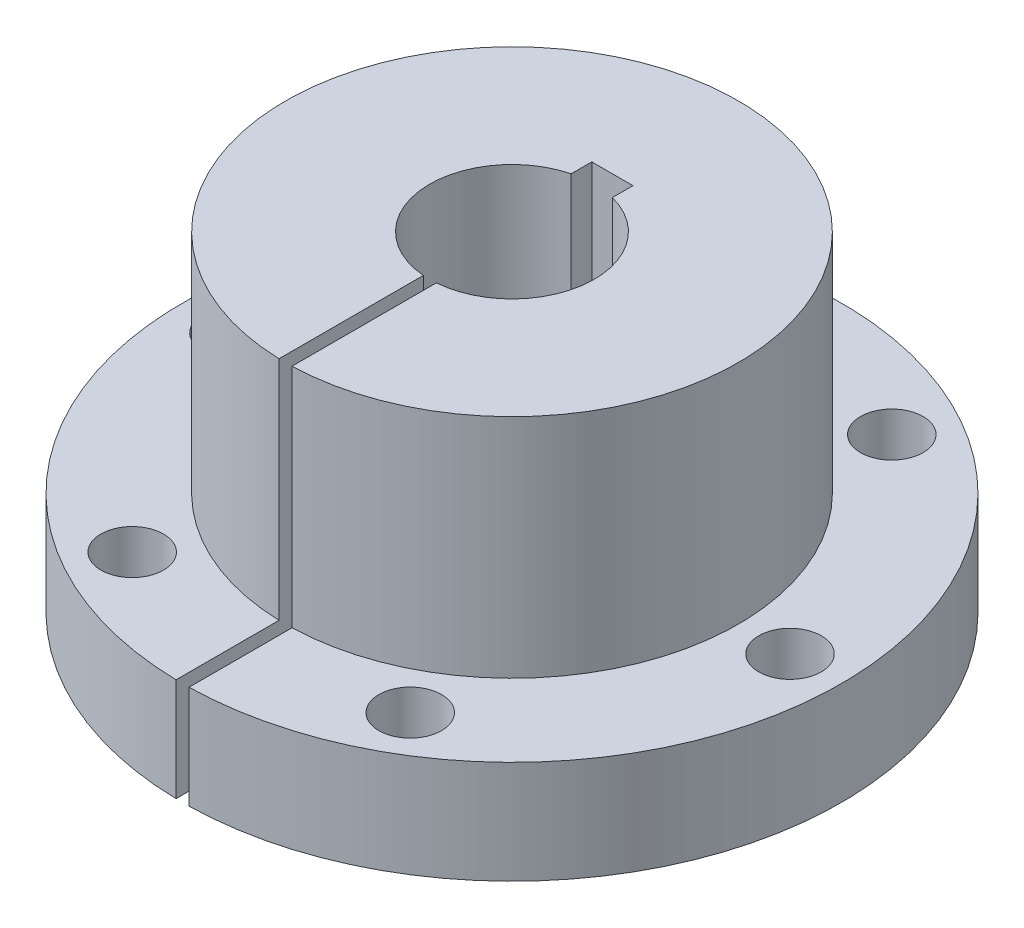
ISO-10303-21;
HEADER;
FILE_DESCRIPTION(('STEP AP214'),'2;1');
FILE_NAME('part.step','',(''),(''),'','','');
FILE_SCHEMA(('AUTOMOTIVE_DESIGN { 1 0 10303 214 1 1 1 1 }'));
ENDSEC;
DATA;
#1=APPLICATION_CONTEXT('core data for automotive mechanical design processes');
#2=APPLICATION_PROTOCOL_DEFINITION('international standard','automotive_design',2000,#1);
#3=PRODUCT_CONTEXT('',#1,'mechanical');
#4=PRODUCT('Part','Part','',(#3));
#5=PRODUCT_RELATED_PRODUCT_CATEGORY('part','',(#4));
#6=PRODUCT_DEFINITION_FORMATION('','',#4);
#7=PRODUCT_DEFINITION_CONTEXT('part definition',#1,'design');
#8=PRODUCT_DEFINITION('design','',#6,#7);
#9=PRODUCT_DEFINITION_SHAPE('','',#8);
#10=(LENGTH_UNIT() NAMED_UNIT(*) SI_UNIT(.MILLI.,.METRE.));
#11=(NAMED_UNIT(*) PLANE_ANGLE_UNIT() SI_UNIT($,.RADIAN.));
#12=(NAMED_UNIT(*) SI_UNIT($,.STERADIAN.) SOLID_ANGLE_UNIT());
#13=UNCERTAINTY_MEASURE_WITH_UNIT(LENGTH_MEASURE(1.E-05),#10,'distance_accuracy_value','');
#14=(GEOMETRIC_REPRESENTATION_CONTEXT(3) GLOBAL_UNCERTAINTY_ASSIGNED_CONTEXT((#13)) GLOBAL_UNIT_ASSIGNED_CONTEXT((#10,
#11,#12)) REPRESENTATION_CONTEXT('',''));
#15=CARTESIAN_POINT('',(0.,0.,0.));
#16=DIRECTION('',(0.,0.,1.));
#17=DIRECTION('',(1.,0.,0.));
#18=AXIS2_PLACEMENT_3D('',#15,#16,#17);
#19=CARTESIAN_POINT('',(0.,7.9375,0.));
#20=DIRECTION('',(0.,-1.,0.));
#21=DIRECTION('',(0.,0.,-1.));
#22=AXIS2_PLACEMENT_3D('',#19,#20,#21);
#23=CYLINDRICAL_SURFACE('',#22,25.4);
#24=CARTESIAN_POINT('',(0.,7.9375,0.));
#25=DIRECTION('',(0.,1.,0.));
#26=DIRECTION('',(0.,0.,1.));
#27=AXIS2_PLACEMENT_3D('',#24,#25,#26);
#28=CIRCLE('',#27,25.4);
#29=CARTESIAN_POINT('',(0.5,7.9375,25.3950782633171));
#30=VERTEX_POINT('',#29);
#31=CARTESIAN_POINT('',(-0.5,7.9375,25.3950782633171));
#32=VERTEX_POINT('',#31);
#33=EDGE_CURVE('E230',#30,#32,#28,.T.);
#34=ORIENTED_EDGE('',*,*,#33,.F.);
#35=DIRECTION('',(0.,-1.,0.));
#36=VECTOR('',#35,1.);
#37=CARTESIAN_POINT('',(0.5,7.9375,25.3950782633171));
#38=LINE('',#37,#36);
#39=CARTESIAN_POINT('',(0.5,0.,25.3950782633171));
#40=VERTEX_POINT('',#39);
#41=EDGE_CURVE('E68',#30,#40,#38,.T.);
#42=ORIENTED_EDGE('',*,*,#41,.T.);
#43=CARTESIAN_POINT('',(0.,0.,0.));
#44=DIRECTION('',(0.,1.,0.));
#45=DIRECTION('',(0.,0.,1.));
#46=AXIS2_PLACEMENT_3D('',#43,#44,#45);
#47=CIRCLE('',#46,25.4);
#48=CARTESIAN_POINT('',(-0.5,0.,25.3950782633171));
#49=VERTEX_POINT('',#48);
#50=EDGE_CURVE('E226',#40,#49,#47,.T.);
#51=ORIENTED_EDGE('',*,*,#50,.T.);
#52=DIRECTION('',(0.,-1.,0.));
#53=VECTOR('',#52,1.);
#54=CARTESIAN_POINT('',(-0.5,7.9375,25.3950782633171));
#55=LINE('',#54,#53);
#56=EDGE_CURVE('E135',#49,#32,#55,.F.);
#57=ORIENTED_EDGE('',*,*,#56,.T.);
#58=EDGE_LOOP('',(#34,#42,#51,#57));
#59=FACE_BOUND('',#58,.T.);
#60=ADVANCED_FACE('F45',(#59),#23,.T.);
#61=CARTESIAN_POINT('',(0.,7.9375,0.));
#62=DIRECTION('',(0.,1.,0.));
#63=DIRECTION('',(0.,0.,1.));
#64=AXIS2_PLACEMENT_3D('',#61,#62,#63);
#65=PLANE('',#64);
#66=CARTESIAN_POINT('',(-10.7156250000002,7.9375,-18.5600069348551));
#67=DIRECTION('',(0.,1.,0.));
#68=DIRECTION('',(-0.866025403784433,0.,0.50000000000001));
#69=AXIS2_PLACEMENT_3D('',#66,#67,#68);
#70=CIRCLE('',#69,2.413);
#71=CARTESIAN_POINT('',(-12.8053442993321,7.9375,-17.3535069348551));
#72=VERTEX_POINT('',#71);
#73=EDGE_CURVE('E350',#72,#72,#70,.T.);
#74=ORIENTED_EDGE('',*,*,#73,.F.);
#75=EDGE_LOOP('',(#74));
#76=FACE_BOUND('',#75,.T.);
#77=CARTESIAN_POINT('',(10.7156249999998,7.9375,-18.5600069348553));
#78=DIRECTION('',(0.,1.,0.));
#79=DIRECTION('',(-0.866025403784443,0.,-0.499999999999992));
#80=AXIS2_PLACEMENT_3D('',#77,#78,#79);
#81=CIRCLE('',#80,2.413);
#82=CARTESIAN_POINT('',(8.62590570066797,7.9375,-19.7665069348553));
#83=VERTEX_POINT('',#82);
#84=EDGE_CURVE('E342',#83,#83,#81,.T.);
#85=ORIENTED_EDGE('',*,*,#84,.F.);
#86=EDGE_LOOP('',(#85));
#87=FACE_BOUND('',#86,.T.);
#88=CARTESIAN_POINT('',(21.43125,7.9375,0.));
#89=DIRECTION('',(0.,1.,0.));
#90=DIRECTION('',(0.,0.,-1.));
#91=AXIS2_PLACEMENT_3D('',#88,#89,#90);
#92=CIRCLE('',#91,2.413);
#93=CARTESIAN_POINT('',(21.43125,7.9375,-2.413));
#94=VERTEX_POINT('',#93);
#95=EDGE_CURVE('E332',#94,#94,#92,.T.);
#96=ORIENTED_EDGE('',*,*,#95,.F.);
#97=EDGE_LOOP('',(#96));
#98=FACE_BOUND('',#97,.T.);
#99=CARTESIAN_POINT('',(10.7156250000001,7.9375,18.5600069348552));
#100=DIRECTION('',(0.,1.,0.));
#101=DIRECTION('',(0.866025403784436,0.,-0.500000000000004));
#102=AXIS2_PLACEMENT_3D('',#99,#100,#101);
#103=CIRCLE('',#102,2.413);
#104=CARTESIAN_POINT('',(12.8053442993319,7.9375,17.3535069348552));
#105=VERTEX_POINT('',#104);
#106=EDGE_CURVE('E322',#105,#105,#103,.T.);
#107=ORIENTED_EDGE('',*,*,#106,.F.);
#108=EDGE_LOOP('',(#107));
#109=FACE_BOUND('',#108,.T.);
#110=CARTESIAN_POINT('',(-10.715625,7.9375,18.5600069348553));
#111=DIRECTION('',(0.,1.,0.));
#112=DIRECTION('',(0.86602540378444,0.,0.499999999999998));
#113=AXIS2_PLACEMENT_3D('',#110,#111,#112);
#114=CIRCLE('',#113,2.413);
#115=CARTESIAN_POINT('',(-8.6259057006681,7.9375,19.7665069348553));
#116=VERTEX_POINT('',#115);
#117=EDGE_CURVE('E329',#116,#116,#114,.T.);
#118=ORIENTED_EDGE('',*,*,#117,.F.);
#119=EDGE_LOOP('',(#118));
#120=FACE_BOUND('',#119,.T.);
#121=CARTESIAN_POINT('',(-21.43125,7.9375,0.));
#122=DIRECTION('',(0.,1.,0.));
#123=DIRECTION('',(0.,0.,1.));
#124=AXIS2_PLACEMENT_3D('',#121,#122,#123);
#125=CIRCLE('',#124,2.413);
#126=CARTESIAN_POINT('',(-21.43125,7.9375,2.413));
#127=VERTEX_POINT('',#126);
#128=EDGE_CURVE('E153',#127,#127,#125,.T.);
#129=ORIENTED_EDGE('',*,*,#128,.F.);
#130=EDGE_LOOP('',(#129));
#131=FACE_BOUND('',#130,.T.);
#132=DIRECTION('',(0.,0.,-1.));
#133=VECTOR('',#132,1.);
#134=CARTESIAN_POINT('',(0.5,7.9375,0.));
#135=LINE('',#134,#133);
#136=CARTESIAN_POINT('',(0.5,7.9375,17.4553403361264));
#137=VERTEX_POINT('',#136);
#138=EDGE_CURVE('E217',#30,#137,#135,.T.);
#139=ORIENTED_EDGE('',*,*,#138,.F.);
#140=ORIENTED_EDGE('',*,*,#33,.T.);
#141=DIRECTION('',(0.,0.,1.));
#142=VECTOR('',#141,1.);
#143=CARTESIAN_POINT('',(-0.5,7.9375,0.));
#144=LINE('',#143,#142);
#145=CARTESIAN_POINT('',(-0.5,7.9375,17.4553403361264));
#146=VERTEX_POINT('',#145);
#147=EDGE_CURVE('E208',#146,#32,#144,.T.);
#148=ORIENTED_EDGE('',*,*,#147,.F.);
#149=CARTESIAN_POINT('',(0.,7.9375,0.));
#150=DIRECTION('',(0.,1.,0.));
#151=DIRECTION('',(0.,0.,1.));
#152=AXIS2_PLACEMENT_3D('',#149,#150,#151);
#153=CIRCLE('',#152,17.4625);
#154=EDGE_CURVE('E53',#137,#146,#153,.T.);
#155=ORIENTED_EDGE('',*,*,#154,.F.);
#156=EDGE_LOOP('',(#139,#140,#148,#155));
#157=FACE_BOUND('',#156,.T.);
#158=ADVANCED_FACE('F261',(#76,#87,#98,#109,#120,#131,#157),#65,.T.);
#159=CARTESIAN_POINT('',(0.,0.,0.));
#160=DIRECTION('',(0.,1.,0.));
#161=DIRECTION('',(0.,0.,1.));
#162=AXIS2_PLACEMENT_3D('',#159,#160,#161);
#163=PLANE('',#162);
#164=CARTESIAN_POINT('',(-10.7156250000002,0.,-18.5600069348551));
#165=DIRECTION('',(0.,1.,0.));
#166=DIRECTION('',(-0.866025403784433,0.,0.50000000000001));
#167=AXIS2_PLACEMENT_3D('',#164,#165,#166);
#168=CIRCLE('',#167,2.413);
#169=CARTESIAN_POINT('',(-12.8053442993321,0.,-17.3535069348551));
#170=VERTEX_POINT('',#169);
#171=EDGE_CURVE('E346',#170,#170,#168,.T.);
#172=ORIENTED_EDGE('',*,*,#171,.T.);
#173=EDGE_LOOP('',(#172));
#174=FACE_BOUND('',#173,.T.);
#175=CARTESIAN_POINT('',(10.7156249999998,0.,-18.5600069348553));
#176=DIRECTION('',(0.,1.,0.));
#177=DIRECTION('',(-0.866025403784443,0.,-0.499999999999992));
#178=AXIS2_PLACEMENT_3D('',#175,#176,#177);
#179=CIRCLE('',#178,2.413);
#180=CARTESIAN_POINT('',(8.62590570066797,0.,-19.7665069348553));
#181=VERTEX_POINT('',#180);
#182=EDGE_CURVE('E338',#181,#181,#179,.T.);
#183=ORIENTED_EDGE('',*,*,#182,.T.);
#184=EDGE_LOOP('',(#183));
#185=FACE_BOUND('',#184,.T.);
#186=CARTESIAN_POINT('',(21.43125,0.,0.));
#187=DIRECTION('',(0.,1.,0.));
#188=DIRECTION('',(0.,0.,-1.));
#189=AXIS2_PLACEMENT_3D('',#186,#187,#188);
#190=CIRCLE('',#189,2.413);
#191=CARTESIAN_POINT('',(21.43125,0.,-2.413));
#192=VERTEX_POINT('',#191);
#193=EDGE_CURVE('E325',#192,#192,#190,.T.);
#194=ORIENTED_EDGE('',*,*,#193,.T.);
#195=EDGE_LOOP('',(#194));
#196=FACE_BOUND('',#195,.T.);
#197=CARTESIAN_POINT('',(10.7156250000001,0.,18.5600069348552));
#198=DIRECTION('',(0.,1.,0.));
#199=DIRECTION('',(0.866025403784436,0.,-0.500000000000004));
#200=AXIS2_PLACEMENT_3D('',#197,#198,#199);
#201=CIRCLE('',#200,2.413);
#202=CARTESIAN_POINT('',(12.8053442993319,0.,17.3535069348552));
#203=VERTEX_POINT('',#202);
#204=EDGE_CURVE('E319',#203,#203,#201,.T.);
#205=ORIENTED_EDGE('',*,*,#204,.T.);
#206=EDGE_LOOP('',(#205));
#207=FACE_BOUND('',#206,.T.);
#208=CARTESIAN_POINT('',(-10.715625,0.,18.5600069348553));
#209=DIRECTION('',(0.,1.,0.));
#210=DIRECTION('',(0.86602540378444,0.,0.499999999999998));
#211=AXIS2_PLACEMENT_3D('',#208,#209,#210);
#212=CIRCLE('',#211,2.413);
#213=CARTESIAN_POINT('',(-8.6259057006681,0.,19.7665069348553));
#214=VERTEX_POINT('',#213);
#215=EDGE_CURVE('E354',#214,#214,#212,.T.);
#216=ORIENTED_EDGE('',*,*,#215,.T.);
#217=EDGE_LOOP('',(#216));
#218=FACE_BOUND('',#217,.T.);
#219=CARTESIAN_POINT('',(-21.43125,0.,0.));
#220=DIRECTION('',(0.,1.,0.));
#221=DIRECTION('',(0.,0.,1.));
#222=AXIS2_PLACEMENT_3D('',#219,#220,#221);
#223=CIRCLE('',#222,2.413);
#224=CARTESIAN_POINT('',(-21.43125,0.,2.413));
#225=VERTEX_POINT('',#224);
#226=EDGE_CURVE('E175',#225,#225,#223,.T.);
#227=ORIENTED_EDGE('',*,*,#226,.T.);
#228=EDGE_LOOP('',(#227));
#229=FACE_BOUND('',#228,.T.);
#230=ORIENTED_EDGE('',*,*,#50,.F.);
#231=DIRECTION('',(0.,0.,-1.));
#232=VECTOR('',#231,1.);
#233=CARTESIAN_POINT('',(0.5,0.,6.33028435380276));
#234=LINE('',#233,#232);
#235=CARTESIAN_POINT('',(0.5,0.,6.33028435380276));
#236=VERTEX_POINT('',#235);
#237=EDGE_CURVE('E140',#40,#236,#234,.T.);
#238=ORIENTED_EDGE('',*,*,#237,.T.);
#239=CARTESIAN_POINT('',(0.,0.,0.));
#240=DIRECTION('',(0.,1.,0.));
#241=DIRECTION('',(0.,0.,1.));
#242=AXIS2_PLACEMENT_3D('',#239,#240,#241);
#243=CIRCLE('',#242,6.35);
#244=CARTESIAN_POINT('',(1.5875,0.,-6.14836106210427));
#245=VERTEX_POINT('',#244);
#246=EDGE_CURVE('E159',#236,#245,#243,.T.);
#247=ORIENTED_EDGE('',*,*,#246,.T.);
#248=DIRECTION('',(0.,0.,-1.));
#249=VECTOR('',#248,1.);
#250=CARTESIAN_POINT('',(1.5875,0.,-7.73586106210427));
#251=LINE('',#250,#249);
#252=CARTESIAN_POINT('',(1.5875,0.,-7.73586106210427));
#253=VERTEX_POINT('',#252);
#254=EDGE_CURVE('E163',#245,#253,#251,.T.);
#255=ORIENTED_EDGE('',*,*,#254,.T.);
#256=DIRECTION('',(-1.,0.,0.));
#257=VECTOR('',#256,1.);
#258=CARTESIAN_POINT('',(-1.5875,0.,-7.73586106210427));
#259=LINE('',#258,#257);
#260=CARTESIAN_POINT('',(-1.5875,0.,-7.73586106210427));
#261=VERTEX_POINT('',#260);
#262=EDGE_CURVE('E167',#253,#261,#259,.T.);
#263=ORIENTED_EDGE('',*,*,#262,.T.);
#264=DIRECTION('',(0.,0.,1.));
#265=VECTOR('',#264,1.);
#266=CARTESIAN_POINT('',(-1.5875,0.,-7.73586106210427));
#267=LINE('',#266,#265);
#268=CARTESIAN_POINT('',(-1.5875,0.,-6.14836106210427));
#269=VERTEX_POINT('',#268);
#270=EDGE_CURVE('E129',#261,#269,#267,.T.);
#271=ORIENTED_EDGE('',*,*,#270,.T.);
#272=CARTESIAN_POINT('',(0.,0.,0.));
#273=DIRECTION('',(0.,1.,0.));
#274=DIRECTION('',(0.,0.,1.));
#275=AXIS2_PLACEMENT_3D('',#272,#273,#274);
#276=CIRCLE('',#275,6.35);
#277=CARTESIAN_POINT('',(-0.5,0.,6.33028435380276));
#278=VERTEX_POINT('',#277);
#279=EDGE_CURVE('E123',#269,#278,#276,.T.);
#280=ORIENTED_EDGE('',*,*,#279,.T.);
#281=DIRECTION('',(0.,0.,1.));
#282=VECTOR('',#281,1.);
#283=CARTESIAN_POINT('',(-0.5,0.,6.33028435380276));
#284=LINE('',#283,#282);
#285=EDGE_CURVE('E132',#278,#49,#284,.T.);
#286=ORIENTED_EDGE('',*,*,#285,.T.);
#287=EDGE_LOOP('',(#230,#238,#247,#255,#263,#271,#280,#286));
#288=FACE_BOUND('',#287,.T.);
#289=ADVANCED_FACE('F142',(#174,#185,#196,#207,#218,#229,#288),#163,.F.);
#290=CARTESIAN_POINT('',(0.,25.4,0.));
#291=DIRECTION('',(0.,-1.,0.));
#292=DIRECTION('',(0.,0.,-1.));
#293=AXIS2_PLACEMENT_3D('',#290,#291,#292);
#294=CYLINDRICAL_SURFACE('',#293,17.4625);
#295=CARTESIAN_POINT('',(0.,25.4,0.));
#296=DIRECTION('',(0.,1.,0.));
#297=DIRECTION('',(0.,0.,1.));
#298=AXIS2_PLACEMENT_3D('',#295,#296,#297);
#299=CIRCLE('',#298,17.4625);
#300=CARTESIAN_POINT('',(0.5,25.4,17.4553403361264));
#301=VERTEX_POINT('',#300);
#302=CARTESIAN_POINT('',(-0.5,25.4,17.4553403361264));
#303=VERTEX_POINT('',#302);
#304=EDGE_CURVE('E222',#301,#303,#299,.T.);
#305=ORIENTED_EDGE('',*,*,#304,.F.);
#306=DIRECTION('',(0.,-1.,0.));
#307=VECTOR('',#306,1.);
#308=CARTESIAN_POINT('',(0.5,25.4,17.4553403361264));
#309=LINE('',#308,#307);
#310=EDGE_CURVE('E213',#301,#137,#309,.T.);
#311=ORIENTED_EDGE('',*,*,#310,.T.);
#312=ORIENTED_EDGE('',*,*,#154,.T.);
#313=DIRECTION('',(0.,-1.,0.));
#314=VECTOR('',#313,1.);
#315=CARTESIAN_POINT('',(-0.5,25.4,17.4553403361264));
#316=LINE('',#315,#314);
#317=EDGE_CURVE('E192',#146,#303,#316,.F.);
#318=ORIENTED_EDGE('',*,*,#317,.T.);
#319=EDGE_LOOP('',(#305,#311,#312,#318));
#320=FACE_BOUND('',#319,.T.);
#321=ADVANCED_FACE('F258',(#320),#294,.T.);
#322=CARTESIAN_POINT('',(0.,25.4,0.));
#323=DIRECTION('',(0.,1.,0.));
#324=DIRECTION('',(0.,0.,1.));
#325=AXIS2_PLACEMENT_3D('',#322,#323,#324);
#326=PLANE('',#325);
#327=DIRECTION('',(0.,0.,-1.));
#328=VECTOR('',#327,1.);
#329=CARTESIAN_POINT('',(0.5,25.4,0.));
#330=LINE('',#329,#328);
#331=CARTESIAN_POINT('',(0.5,25.4,6.33028435380276));
#332=VERTEX_POINT('',#331);
#333=EDGE_CURVE('E11',#301,#332,#330,.T.);
#334=ORIENTED_EDGE('',*,*,#333,.F.);
#335=ORIENTED_EDGE('',*,*,#304,.T.);
#336=DIRECTION('',(0.,0.,1.));
#337=VECTOR('',#336,1.);
#338=CARTESIAN_POINT('',(-0.5,25.4,6.33028435380276));
#339=LINE('',#338,#337);
#340=CARTESIAN_POINT('',(-0.5,25.4,6.33028435380276));
#341=VERTEX_POINT('',#340);
#342=EDGE_CURVE('E174',#341,#303,#339,.T.);
#343=ORIENTED_EDGE('',*,*,#342,.F.);
#344=CARTESIAN_POINT('',(0.,25.4,0.));
#345=DIRECTION('',(0.,1.,0.));
#346=DIRECTION('',(0.,0.,1.));
#347=AXIS2_PLACEMENT_3D('',#344,#345,#346);
#348=CIRCLE('',#347,6.35);
#349=CARTESIAN_POINT('',(-1.5875,25.4,-6.14836106210427));
#350=VERTEX_POINT('',#349);
#351=EDGE_CURVE('E60',#350,#341,#348,.T.);
#352=ORIENTED_EDGE('',*,*,#351,.F.);
#353=DIRECTION('',(0.,0.,1.));
#354=VECTOR('',#353,1.);
#355=CARTESIAN_POINT('',(-1.5875,25.4,-7.73586106210427));
#356=LINE('',#355,#354);
#357=CARTESIAN_POINT('',(-1.5875,25.4,-7.73586106210427));
#358=VERTEX_POINT('',#357);
#359=EDGE_CURVE('E146',#358,#350,#356,.T.);
#360=ORIENTED_EDGE('',*,*,#359,.F.);
#361=DIRECTION('',(-1.,0.,0.));
#362=VECTOR('',#361,1.);
#363=CARTESIAN_POINT('',(-1.5875,25.4,-7.73586106210427));
#364=LINE('',#363,#362);
#365=CARTESIAN_POINT('',(1.5875,25.4,-7.73586106210427));
#366=VERTEX_POINT('',#365);
#367=EDGE_CURVE('E150',#366,#358,#364,.T.);
#368=ORIENTED_EDGE('',*,*,#367,.F.);
#369=DIRECTION('',(0.,0.,-1.));
#370=VECTOR('',#369,1.);
#371=CARTESIAN_POINT('',(1.5875,25.4,-7.73586106210427));
#372=LINE('',#371,#370);
#373=CARTESIAN_POINT('',(1.5875,25.4,-6.14836106210427));
#374=VERTEX_POINT('',#373);
#375=EDGE_CURVE('E182',#374,#366,#372,.T.);
#376=ORIENTED_EDGE('',*,*,#375,.F.);
#377=CARTESIAN_POINT('',(0.,25.4,0.));
#378=DIRECTION('',(0.,1.,0.));
#379=DIRECTION('',(0.,0.,1.));
#380=AXIS2_PLACEMENT_3D('',#377,#378,#379);
#381=CIRCLE('',#380,6.35);
#382=EDGE_CURVE('E178',#332,#374,#381,.T.);
#383=ORIENTED_EDGE('',*,*,#382,.F.);
#384=EDGE_LOOP('',(#334,#335,#343,#352,#360,#368,#376,#383));
#385=FACE_BOUND('',#384,.T.);
#386=ADVANCED_FACE('F254',(#385),#326,.T.);
#387=CARTESIAN_POINT('',(0.5,0.,6.33028435380276));
#388=DIRECTION('',(1.,0.,0.));
#389=DIRECTION('',(0.,0.,-1.));
#390=AXIS2_PLACEMENT_3D('',#387,#388,#389);
#391=PLANE('',#390);
#392=ORIENTED_EDGE('',*,*,#138,.T.);
#393=ORIENTED_EDGE('',*,*,#310,.F.);
#394=ORIENTED_EDGE('',*,*,#333,.T.);
#395=DIRECTION('',(0.,1.,0.));
#396=VECTOR('',#395,1.);
#397=CARTESIAN_POINT('',(0.5,0.,6.33028435380276));
#398=LINE('',#397,#396);
#399=EDGE_CURVE('E128',#236,#332,#398,.T.);
#400=ORIENTED_EDGE('',*,*,#399,.F.);
#401=ORIENTED_EDGE('',*,*,#237,.F.);
#402=ORIENTED_EDGE('',*,*,#41,.F.);
#403=EDGE_LOOP('',(#392,#393,#394,#400,#401,#402));
#404=FACE_BOUND('',#403,.T.);
#405=ADVANCED_FACE('F237',(#404),#391,.F.);
#406=CARTESIAN_POINT('',(-0.5,0.,6.33028435380276));
#407=DIRECTION('',(-1.,0.,0.));
#408=DIRECTION('',(0.,0.,1.));
#409=AXIS2_PLACEMENT_3D('',#406,#407,#408);
#410=PLANE('',#409);
#411=ORIENTED_EDGE('',*,*,#285,.F.);
#412=DIRECTION('',(0.,1.,0.));
#413=VECTOR('',#412,1.);
#414=CARTESIAN_POINT('',(-0.5,0.,6.33028435380276));
#415=LINE('',#414,#413);
#416=EDGE_CURVE('E119',#278,#341,#415,.T.);
#417=ORIENTED_EDGE('',*,*,#416,.T.);
#418=ORIENTED_EDGE('',*,*,#342,.T.);
#419=ORIENTED_EDGE('',*,*,#317,.F.);
#420=ORIENTED_EDGE('',*,*,#147,.T.);
#421=ORIENTED_EDGE('',*,*,#56,.F.);
#422=EDGE_LOOP('',(#411,#417,#418,#419,#420,#421));
#423=FACE_BOUND('',#422,.T.);
#424=ADVANCED_FACE('F133',(#423),#410,.F.);
#425=CARTESIAN_POINT('',(0.,0.,0.));
#426=DIRECTION('',(0.,1.,0.));
#427=DIRECTION('',(0.,0.,1.));
#428=AXIS2_PLACEMENT_3D('',#425,#426,#427);
#429=CYLINDRICAL_SURFACE('',#428,6.35);
#430=ORIENTED_EDGE('',*,*,#351,.T.);
#431=ORIENTED_EDGE('',*,*,#416,.F.);
#432=ORIENTED_EDGE('',*,*,#279,.F.);
#433=DIRECTION('',(0.,1.,0.));
#434=VECTOR('',#433,1.);
#435=CARTESIAN_POINT('',(-1.5875,0.,-6.14836106210427));
#436=LINE('',#435,#434);
#437=EDGE_CURVE('E189',#269,#350,#436,.T.);
#438=ORIENTED_EDGE('',*,*,#437,.T.);
#439=EDGE_LOOP('',(#430,#431,#432,#438));
#440=FACE_BOUND('',#439,.T.);
#441=ADVANCED_FACE('F121',(#440),#429,.F.);
#442=CARTESIAN_POINT('',(-1.5875,0.,-7.73586106210427));
#443=DIRECTION('',(-1.,0.,0.));
#444=DIRECTION('',(0.,0.,1.));
#445=AXIS2_PLACEMENT_3D('',#442,#443,#444);
#446=PLANE('',#445);
#447=ORIENTED_EDGE('',*,*,#359,.T.);
#448=ORIENTED_EDGE('',*,*,#437,.F.);
#449=ORIENTED_EDGE('',*,*,#270,.F.);
#450=DIRECTION('',(0.,1.,0.));
#451=VECTOR('',#450,1.);
#452=CARTESIAN_POINT('',(-1.5875,0.,-7.73586106210427));
#453=LINE('',#452,#451);
#454=EDGE_CURVE('E193',#261,#358,#453,.T.);
#455=ORIENTED_EDGE('',*,*,#454,.T.);
#456=EDGE_LOOP('',(#447,#448,#449,#455));
#457=FACE_BOUND('',#456,.T.);
#458=ADVANCED_FACE('F252',(#457),#446,.F.);
#459=CARTESIAN_POINT('',(-1.5875,0.,-7.73586106210427));
#460=DIRECTION('',(0.,0.,-1.));
#461=DIRECTION('',(-1.,0.,0.));
#462=AXIS2_PLACEMENT_3D('',#459,#460,#461);
#463=PLANE('',#462);
#464=ORIENTED_EDGE('',*,*,#367,.T.);
#465=ORIENTED_EDGE('',*,*,#454,.F.);
#466=ORIENTED_EDGE('',*,*,#262,.F.);
#467=DIRECTION('',(0.,1.,0.));
#468=VECTOR('',#467,1.);
#469=CARTESIAN_POINT('',(1.5875,0.,-7.73586106210427));
#470=LINE('',#469,#468);
#471=EDGE_CURVE('E196',#253,#366,#470,.T.);
#472=ORIENTED_EDGE('',*,*,#471,.T.);
#473=EDGE_LOOP('',(#464,#465,#466,#472));
#474=FACE_BOUND('',#473,.T.);
#475=ADVANCED_FACE('F248',(#474),#463,.F.);
#476=CARTESIAN_POINT('',(1.5875,0.,-7.73586106210427));
#477=DIRECTION('',(1.,0.,0.));
#478=DIRECTION('',(0.,0.,-1.));
#479=AXIS2_PLACEMENT_3D('',#476,#477,#478);
#480=PLANE('',#479);
#481=ORIENTED_EDGE('',*,*,#375,.T.);
#482=ORIENTED_EDGE('',*,*,#471,.F.);
#483=ORIENTED_EDGE('',*,*,#254,.F.);
#484=DIRECTION('',(0.,1.,0.));
#485=VECTOR('',#484,1.);
#486=CARTESIAN_POINT('',(1.5875,0.,-6.14836106210427));
#487=LINE('',#486,#485);
#488=EDGE_CURVE('E199',#245,#374,#487,.T.);
#489=ORIENTED_EDGE('',*,*,#488,.T.);
#490=EDGE_LOOP('',(#481,#482,#483,#489));
#491=FACE_BOUND('',#490,.T.);
#492=ADVANCED_FACE('F245',(#491),#480,.F.);
#493=CARTESIAN_POINT('',(0.,0.,0.));
#494=DIRECTION('',(0.,1.,0.));
#495=DIRECTION('',(0.,0.,1.));
#496=AXIS2_PLACEMENT_3D('',#493,#494,#495);
#497=CYLINDRICAL_SURFACE('',#496,6.35);
#498=ORIENTED_EDGE('',*,*,#382,.T.);
#499=ORIENTED_EDGE('',*,*,#488,.F.);
#500=ORIENTED_EDGE('',*,*,#246,.F.);
#501=ORIENTED_EDGE('',*,*,#399,.T.);
#502=EDGE_LOOP('',(#498,#499,#500,#501));
#503=FACE_BOUND('',#502,.T.);
#504=ADVANCED_FACE('F241',(#503),#497,.F.);
#505=CARTESIAN_POINT('',(-21.43125,0.,0.));
#506=DIRECTION('',(0.,1.,0.));
#507=DIRECTION('',(0.,0.,1.));
#508=AXIS2_PLACEMENT_3D('',#505,#506,#507);
#509=CYLINDRICAL_SURFACE('',#508,2.413);
#510=ORIENTED_EDGE('',*,*,#226,.F.);
#511=EDGE_LOOP('',(#510));
#512=FACE_BOUND('',#511,.T.);
#513=ORIENTED_EDGE('',*,*,#128,.T.);
#514=EDGE_LOOP('',(#513));
#515=FACE_BOUND('',#514,.T.);
#516=ADVANCED_FACE('F286',(#512,#515),#509,.F.);
#517=CARTESIAN_POINT('',(-10.715625,0.,18.5600069348553));
#518=DIRECTION('',(0.,1.,0.));
#519=DIRECTION('',(0.,0.,1.));
#520=AXIS2_PLACEMENT_3D('',#517,#518,#519);
#521=CYLINDRICAL_SURFACE('',#520,2.413);
#522=ORIENTED_EDGE('',*,*,#215,.F.);
#523=EDGE_LOOP('',(#522));
#524=FACE_BOUND('',#523,.T.);
#525=ORIENTED_EDGE('',*,*,#117,.T.);
#526=EDGE_LOOP('',(#525));
#527=FACE_BOUND('',#526,.T.);
#528=ADVANCED_FACE('F294',(#524,#527),#521,.F.);
#529=CARTESIAN_POINT('',(10.7156250000001,0.,18.5600069348552));
#530=DIRECTION('',(0.,1.,0.));
#531=DIRECTION('',(0.,0.,1.));
#532=AXIS2_PLACEMENT_3D('',#529,#530,#531);
#533=CYLINDRICAL_SURFACE('',#532,2.413);
#534=ORIENTED_EDGE('',*,*,#204,.F.);
#535=EDGE_LOOP('',(#534));
#536=FACE_BOUND('',#535,.T.);
#537=ORIENTED_EDGE('',*,*,#106,.T.);
#538=EDGE_LOOP('',(#537));
#539=FACE_BOUND('',#538,.T.);
#540=ADVANCED_FACE('F298',(#536,#539),#533,.F.);
#541=CARTESIAN_POINT('',(21.43125,0.,0.));
#542=DIRECTION('',(0.,1.,0.));
#543=DIRECTION('',(0.,0.,1.));
#544=AXIS2_PLACEMENT_3D('',#541,#542,#543);
#545=CYLINDRICAL_SURFACE('',#544,2.413);
#546=ORIENTED_EDGE('',*,*,#193,.F.);
#547=EDGE_LOOP('',(#546));
#548=FACE_BOUND('',#547,.T.);
#549=ORIENTED_EDGE('',*,*,#95,.T.);
#550=EDGE_LOOP('',(#549));
#551=FACE_BOUND('',#550,.T.);
#552=ADVANCED_FACE('F307',(#548,#551),#545,.F.);
#553=CARTESIAN_POINT('',(10.7156249999998,0.,-18.5600069348553));
#554=DIRECTION('',(0.,1.,0.));
#555=DIRECTION('',(0.,0.,1.));
#556=AXIS2_PLACEMENT_3D('',#553,#554,#555);
#557=CYLINDRICAL_SURFACE('',#556,2.413);
#558=ORIENTED_EDGE('',*,*,#182,.F.);
#559=EDGE_LOOP('',(#558));
#560=FACE_BOUND('',#559,.T.);
#561=ORIENTED_EDGE('',*,*,#84,.T.);
#562=EDGE_LOOP('',(#561));
#563=FACE_BOUND('',#562,.T.);
#564=ADVANCED_FACE('F303',(#560,#563),#557,.F.);
#565=CARTESIAN_POINT('',(-10.7156250000002,0.,-18.5600069348551));
#566=DIRECTION('',(0.,1.,0.));
#567=DIRECTION('',(0.,0.,1.));
#568=AXIS2_PLACEMENT_3D('',#565,#566,#567);
#569=CYLINDRICAL_SURFACE('',#568,2.413);
#570=ORIENTED_EDGE('',*,*,#171,.F.);
#571=EDGE_LOOP('',(#570));
#572=FACE_BOUND('',#571,.T.);
#573=ORIENTED_EDGE('',*,*,#73,.T.);
#574=EDGE_LOOP('',(#573));
#575=FACE_BOUND('',#574,.T.);
#576=ADVANCED_FACE('F300',(#572,#575),#569,.F.);
#577=CLOSED_SHELL('',(#60,#158,#289,#321,#386,#405,#424,#441,#458,#475,#492,#504,#516,#528,#540,
#552,#564,#576));
#578=MANIFOLD_SOLID_BREP('B2',#577);
#579=ADVANCED_BREP_SHAPE_REPRESENTATION('',(#18,#578),#14);
#580=SHAPE_DEFINITION_REPRESENTATION(#9,#579);
ENDSEC;
END-ISO-10303-21;
